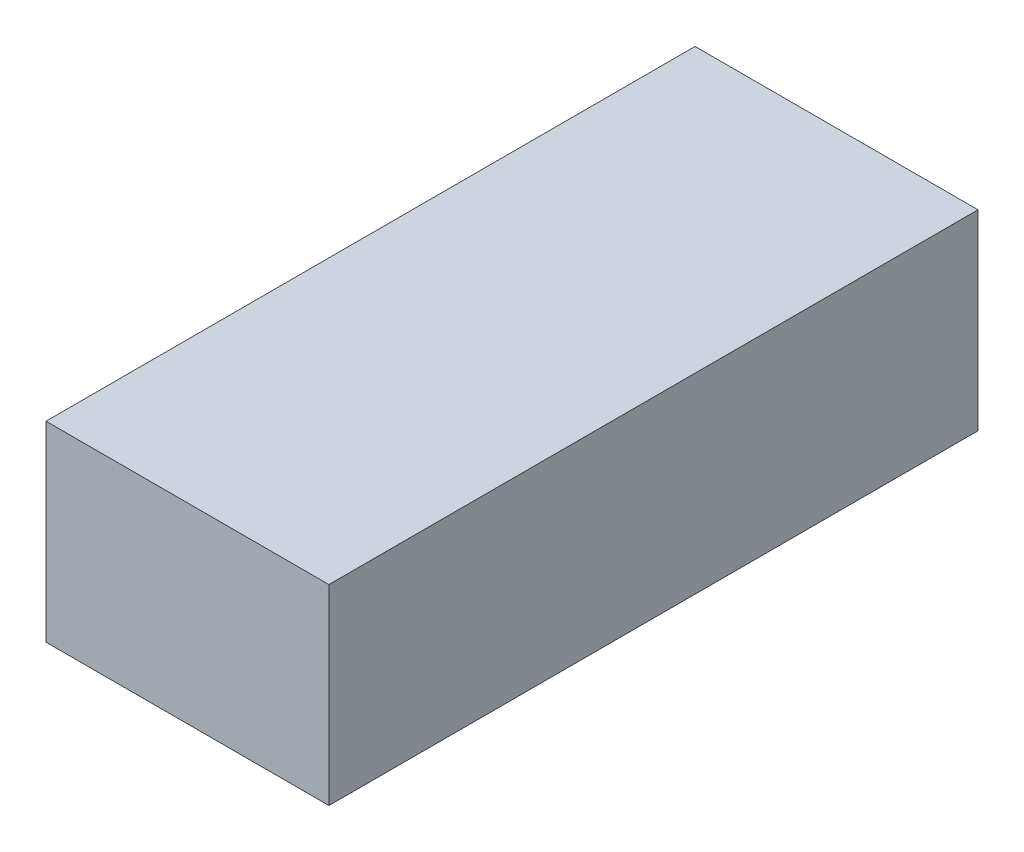
ISO-10303-21;
HEADER;
FILE_DESCRIPTION(('STEP AP214'),'2;1');
FILE_NAME('part.step','',(''),(''),'','','');
FILE_SCHEMA(('AUTOMOTIVE_DESIGN { 1 0 10303 214 1 1 1 1 }'));
ENDSEC;
DATA;
#1=APPLICATION_CONTEXT('core data for automotive mechanical design processes');
#2=APPLICATION_PROTOCOL_DEFINITION('international standard','automotive_design',2000,#1);
#3=PRODUCT_CONTEXT('',#1,'mechanical');
#4=PRODUCT('Part','Part','',(#3));
#5=PRODUCT_RELATED_PRODUCT_CATEGORY('part','',(#4));
#6=PRODUCT_DEFINITION_FORMATION('','',#4);
#7=PRODUCT_DEFINITION_CONTEXT('part definition',#1,'design');
#8=PRODUCT_DEFINITION('design','',#6,#7);
#9=PRODUCT_DEFINITION_SHAPE('','',#8);
#10=(LENGTH_UNIT() NAMED_UNIT(*) SI_UNIT(.MILLI.,.METRE.));
#11=(NAMED_UNIT(*) PLANE_ANGLE_UNIT() SI_UNIT($,.RADIAN.));
#12=(NAMED_UNIT(*) SI_UNIT($,.STERADIAN.) SOLID_ANGLE_UNIT());
#13=UNCERTAINTY_MEASURE_WITH_UNIT(LENGTH_MEASURE(1.E-05),#10,'distance_accuracy_value','');
#14=(GEOMETRIC_REPRESENTATION_CONTEXT(3) GLOBAL_UNCERTAINTY_ASSIGNED_CONTEXT((#13)) GLOBAL_UNIT_ASSIGNED_CONTEXT((#10,
#11,#12)) REPRESENTATION_CONTEXT('',''));
#15=CARTESIAN_POINT('',(0.,0.,0.));
#16=DIRECTION('',(0.,0.,1.));
#17=DIRECTION('',(1.,0.,0.));
#18=AXIS2_PLACEMENT_3D('',#15,#16,#17);
#19=CARTESIAN_POINT('',(0.,23.,0.));
#20=DIRECTION('',(1.,0.,0.));
#21=DIRECTION('',(0.,0.,-1.));
#22=AXIS2_PLACEMENT_3D('',#19,#20,#21);
#23=PLANE('',#22);
#24=DIRECTION('',(0.,0.,1.));
#25=VECTOR('',#24,1.);
#26=CARTESIAN_POINT('',(0.,0.,0.));
#27=LINE('',#26,#25);
#28=CARTESIAN_POINT('',(0.,0.,-78.));
#29=VERTEX_POINT('',#28);
#30=CARTESIAN_POINT('',(0.,0.,0.));
#31=VERTEX_POINT('',#30);
#32=EDGE_CURVE('E97',#29,#31,#27,.T.);
#33=ORIENTED_EDGE('',*,*,#32,.T.);
#34=DIRECTION('',(0.,-1.,0.));
#35=VECTOR('',#34,1.);
#36=CARTESIAN_POINT('',(0.,23.,0.));
#37=LINE('',#36,#35);
#38=CARTESIAN_POINT('',(0.,23.,0.));
#39=VERTEX_POINT('',#38);
#40=EDGE_CURVE('E11',#39,#31,#37,.T.);
#41=ORIENTED_EDGE('',*,*,#40,.F.);
#42=DIRECTION('',(0.,0.,1.));
#43=VECTOR('',#42,1.);
#44=CARTESIAN_POINT('',(0.,23.,0.));
#45=LINE('',#44,#43);
#46=CARTESIAN_POINT('',(0.,23.,-78.));
#47=VERTEX_POINT('',#46);
#48=EDGE_CURVE('E85',#47,#39,#45,.T.);
#49=ORIENTED_EDGE('',*,*,#48,.F.);
#50=DIRECTION('',(0.,-1.,0.));
#51=VECTOR('',#50,1.);
#52=CARTESIAN_POINT('',(0.,23.,-78.));
#53=LINE('',#52,#51);
#54=EDGE_CURVE('E93',#47,#29,#53,.T.);
#55=ORIENTED_EDGE('',*,*,#54,.T.);
#56=EDGE_LOOP('',(#33,#41,#49,#55));
#57=FACE_BOUND('',#56,.T.);
#58=ADVANCED_FACE('F34',(#57),#23,.F.);
#59=CARTESIAN_POINT('',(0.,23.,0.));
#60=DIRECTION('',(0.,0.,-1.));
#61=DIRECTION('',(-1.,0.,0.));
#62=AXIS2_PLACEMENT_3D('',#59,#60,#61);
#63=PLANE('',#62);
#64=DIRECTION('',(1.,0.,0.));
#65=VECTOR('',#64,1.);
#66=CARTESIAN_POINT('',(0.,0.,0.));
#67=LINE('',#66,#65);
#68=CARTESIAN_POINT('',(34.,0.,0.));
#69=VERTEX_POINT('',#68);
#70=EDGE_CURVE('E89',#31,#69,#67,.T.);
#71=ORIENTED_EDGE('',*,*,#70,.T.);
#72=DIRECTION('',(0.,-1.,0.));
#73=VECTOR('',#72,1.);
#74=CARTESIAN_POINT('',(34.,23.,0.));
#75=LINE('',#74,#73);
#76=CARTESIAN_POINT('',(34.,23.,0.));
#77=VERTEX_POINT('',#76);
#78=EDGE_CURVE('E42',#77,#69,#75,.T.);
#79=ORIENTED_EDGE('',*,*,#78,.F.);
#80=DIRECTION('',(1.,0.,0.));
#81=VECTOR('',#80,1.);
#82=CARTESIAN_POINT('',(0.,23.,0.));
#83=LINE('',#82,#81);
#84=EDGE_CURVE('E80',#39,#77,#83,.T.);
#85=ORIENTED_EDGE('',*,*,#84,.F.);
#86=ORIENTED_EDGE('',*,*,#40,.T.);
#87=EDGE_LOOP('',(#71,#79,#85,#86));
#88=FACE_BOUND('',#87,.T.);
#89=ADVANCED_FACE('F88',(#88),#63,.F.);
#90=CARTESIAN_POINT('',(34.,23.,0.));
#91=DIRECTION('',(-1.,0.,0.));
#92=DIRECTION('',(0.,0.,1.));
#93=AXIS2_PLACEMENT_3D('',#90,#91,#92);
#94=PLANE('',#93);
#95=DIRECTION('',(0.,0.,-1.));
#96=VECTOR('',#95,1.);
#97=CARTESIAN_POINT('',(34.,0.,0.));
#98=LINE('',#97,#96);
#99=CARTESIAN_POINT('',(34.,0.,-78.));
#100=VERTEX_POINT('',#99);
#101=EDGE_CURVE('E67',#69,#100,#98,.T.);
#102=ORIENTED_EDGE('',*,*,#101,.T.);
#103=DIRECTION('',(0.,-1.,0.));
#104=VECTOR('',#103,1.);
#105=CARTESIAN_POINT('',(34.,23.,-78.));
#106=LINE('',#105,#104);
#107=CARTESIAN_POINT('',(34.,23.,-78.));
#108=VERTEX_POINT('',#107);
#109=EDGE_CURVE('E90',#108,#100,#106,.T.);
#110=ORIENTED_EDGE('',*,*,#109,.F.);
#111=DIRECTION('',(0.,0.,-1.));
#112=VECTOR('',#111,1.);
#113=CARTESIAN_POINT('',(34.,23.,0.));
#114=LINE('',#113,#112);
#115=EDGE_CURVE('E83',#77,#108,#114,.T.);
#116=ORIENTED_EDGE('',*,*,#115,.F.);
#117=ORIENTED_EDGE('',*,*,#78,.T.);
#118=EDGE_LOOP('',(#102,#110,#116,#117));
#119=FACE_BOUND('',#118,.T.);
#120=ADVANCED_FACE('F91',(#119),#94,.F.);
#121=CARTESIAN_POINT('',(0.,23.,-78.));
#122=DIRECTION('',(0.,0.,1.));
#123=DIRECTION('',(1.,0.,0.));
#124=AXIS2_PLACEMENT_3D('',#121,#122,#123);
#125=PLANE('',#124);
#126=DIRECTION('',(-1.,0.,0.));
#127=VECTOR('',#126,1.);
#128=CARTESIAN_POINT('',(0.,0.,-78.));
#129=LINE('',#128,#127);
#130=EDGE_CURVE('E73',#100,#29,#129,.T.);
#131=ORIENTED_EDGE('',*,*,#130,.T.);
#132=ORIENTED_EDGE('',*,*,#54,.F.);
#133=DIRECTION('',(-1.,0.,0.));
#134=VECTOR('',#133,1.);
#135=CARTESIAN_POINT('',(0.,23.,-78.));
#136=LINE('',#135,#134);
#137=EDGE_CURVE('E50',#108,#47,#136,.T.);
#138=ORIENTED_EDGE('',*,*,#137,.F.);
#139=ORIENTED_EDGE('',*,*,#109,.T.);
#140=EDGE_LOOP('',(#131,#132,#138,#139));
#141=FACE_BOUND('',#140,.T.);
#142=ADVANCED_FACE('F104',(#141),#125,.F.);
#143=CARTESIAN_POINT('',(0.,23.,0.));
#144=DIRECTION('',(0.,-1.,0.));
#145=DIRECTION('',(0.,0.,-1.));
#146=AXIS2_PLACEMENT_3D('',#143,#144,#145);
#147=PLANE('',#146);
#148=ORIENTED_EDGE('',*,*,#48,.T.);
#149=ORIENTED_EDGE('',*,*,#84,.T.);
#150=ORIENTED_EDGE('',*,*,#115,.T.);
#151=ORIENTED_EDGE('',*,*,#137,.T.);
#152=EDGE_LOOP('',(#148,#149,#150,#151));
#153=FACE_BOUND('',#152,.T.);
#154=ADVANCED_FACE('F81',(#153),#147,.F.);
#155=CARTESIAN_POINT('',(0.,0.,0.));
#156=DIRECTION('',(0.,-1.,0.));
#157=DIRECTION('',(0.,0.,-1.));
#158=AXIS2_PLACEMENT_3D('',#155,#156,#157);
#159=PLANE('',#158);
#160=ORIENTED_EDGE('',*,*,#32,.F.);
#161=ORIENTED_EDGE('',*,*,#130,.F.);
#162=ORIENTED_EDGE('',*,*,#101,.F.);
#163=ORIENTED_EDGE('',*,*,#70,.F.);
#164=EDGE_LOOP('',(#160,#161,#162,#163));
#165=FACE_BOUND('',#164,.T.);
#166=ADVANCED_FACE('F107',(#165),#159,.T.);
#167=CLOSED_SHELL('',(#58,#89,#120,#142,#154,#166));
#168=MANIFOLD_SOLID_BREP('B2',#167);
#169=ADVANCED_BREP_SHAPE_REPRESENTATION('',(#18,#168),#14);
#170=SHAPE_DEFINITION_REPRESENTATION(#9,#169);
ENDSEC;
END-ISO-10303-21;
